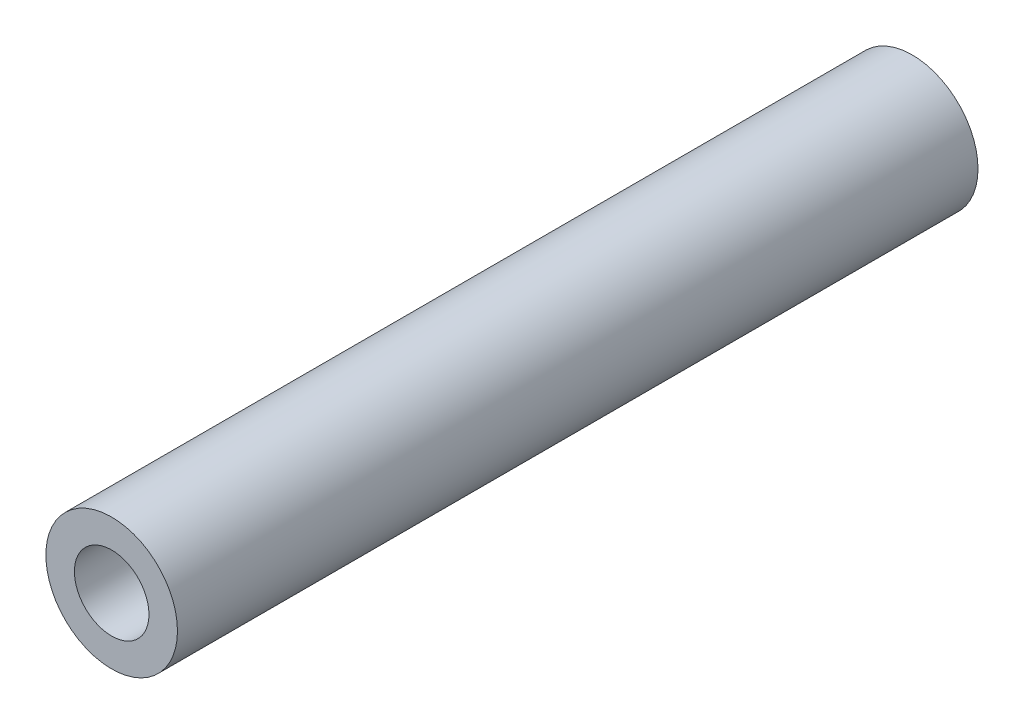
ISO-10303-21;
HEADER;
FILE_DESCRIPTION(('STEP AP214'),'2;1');
FILE_NAME('part.step','',(''),(''),'','','');
FILE_SCHEMA(('AUTOMOTIVE_DESIGN { 1 0 10303 214 1 1 1 1 }'));
ENDSEC;
DATA;
#1=APPLICATION_CONTEXT('core data for automotive mechanical design processes');
#2=APPLICATION_PROTOCOL_DEFINITION('international standard','automotive_design',2000,#1);
#3=PRODUCT_CONTEXT('',#1,'mechanical');
#4=PRODUCT('Part','Part','',(#3));
#5=PRODUCT_RELATED_PRODUCT_CATEGORY('part','',(#4));
#6=PRODUCT_DEFINITION_FORMATION('','',#4);
#7=PRODUCT_DEFINITION_CONTEXT('part definition',#1,'design');
#8=PRODUCT_DEFINITION('design','',#6,#7);
#9=PRODUCT_DEFINITION_SHAPE('','',#8);
#10=(LENGTH_UNIT() NAMED_UNIT(*) SI_UNIT(.MILLI.,.METRE.));
#11=(NAMED_UNIT(*) PLANE_ANGLE_UNIT() SI_UNIT($,.RADIAN.));
#12=(NAMED_UNIT(*) SI_UNIT($,.STERADIAN.) SOLID_ANGLE_UNIT());
#13=UNCERTAINTY_MEASURE_WITH_UNIT(LENGTH_MEASURE(1.E-05),#10,'distance_accuracy_value','');
#14=(GEOMETRIC_REPRESENTATION_CONTEXT(3) GLOBAL_UNCERTAINTY_ASSIGNED_CONTEXT((#13)) GLOBAL_UNIT_ASSIGNED_CONTEXT((#10,
#11,#12)) REPRESENTATION_CONTEXT('',''));
#15=CARTESIAN_POINT('',(0.,0.,0.));
#16=DIRECTION('',(0.,0.,1.));
#17=DIRECTION('',(1.,0.,0.));
#18=AXIS2_PLACEMENT_3D('',#15,#16,#17);
#19=CARTESIAN_POINT('',(0.,0.,36.5));
#20=DIRECTION('',(0.,0.,1.));
#21=DIRECTION('',(1.,0.,0.));
#22=AXIS2_PLACEMENT_3D('',#19,#20,#21);
#23=PLANE('',#22);
#24=CARTESIAN_POINT('',(0.,0.,36.5));
#25=DIRECTION('',(0.,0.,1.));
#26=DIRECTION('',(1.,0.,0.));
#27=AXIS2_PLACEMENT_3D('',#24,#25,#26);
#28=CIRCLE('',#27,3.);
#29=CARTESIAN_POINT('',(3.,0.,36.5));
#30=VERTEX_POINT('',#29);
#31=EDGE_CURVE('E10',#30,#30,#28,.T.);
#32=ORIENTED_EDGE('',*,*,#31,.T.);
#33=EDGE_LOOP('',(#32));
#34=FACE_BOUND('',#33,.T.);
#35=CARTESIAN_POINT('',(0.,0.,36.5));
#36=DIRECTION('',(0.,0.,1.));
#37=DIRECTION('',(1.,0.,0.));
#38=AXIS2_PLACEMENT_3D('',#35,#36,#37);
#39=CIRCLE('',#38,1.7);
#40=CARTESIAN_POINT('',(1.7,0.,36.5));
#41=VERTEX_POINT('',#40);
#42=EDGE_CURVE('E48',#41,#41,#39,.T.);
#43=ORIENTED_EDGE('',*,*,#42,.F.);
#44=EDGE_LOOP('',(#43));
#45=FACE_BOUND('',#44,.T.);
#46=ADVANCED_FACE('F40',(#34,#45),#23,.T.);
#47=CARTESIAN_POINT('',(0.,0.,0.));
#48=DIRECTION('',(0.,0.,1.));
#49=DIRECTION('',(1.,0.,0.));
#50=AXIS2_PLACEMENT_3D('',#47,#48,#49);
#51=PLANE('',#50);
#52=CARTESIAN_POINT('',(0.,0.,0.));
#53=DIRECTION('',(0.,0.,1.));
#54=DIRECTION('',(1.,0.,0.));
#55=AXIS2_PLACEMENT_3D('',#52,#53,#54);
#56=CIRCLE('',#55,3.);
#57=CARTESIAN_POINT('',(3.,0.,0.));
#58=VERTEX_POINT('',#57);
#59=EDGE_CURVE('E41',#58,#58,#56,.T.);
#60=ORIENTED_EDGE('',*,*,#59,.F.);
#61=EDGE_LOOP('',(#60));
#62=FACE_BOUND('',#61,.T.);
#63=CARTESIAN_POINT('',(0.,0.,0.));
#64=DIRECTION('',(0.,0.,1.));
#65=DIRECTION('',(1.,0.,0.));
#66=AXIS2_PLACEMENT_3D('',#63,#64,#65);
#67=CIRCLE('',#66,1.7);
#68=CARTESIAN_POINT('',(1.7,0.,0.));
#69=VERTEX_POINT('',#68);
#70=EDGE_CURVE('E49',#69,#69,#67,.T.);
#71=ORIENTED_EDGE('',*,*,#70,.T.);
#72=EDGE_LOOP('',(#71));
#73=FACE_BOUND('',#72,.T.);
#74=ADVANCED_FACE('F58',(#62,#73),#51,.F.);
#75=CARTESIAN_POINT('',(0.,0.,36.5));
#76=DIRECTION('',(0.,0.,-1.));
#77=DIRECTION('',(-1.,0.,0.));
#78=AXIS2_PLACEMENT_3D('',#75,#76,#77);
#79=CYLINDRICAL_SURFACE('',#78,3.);
#80=ORIENTED_EDGE('',*,*,#31,.F.);
#81=EDGE_LOOP('',(#80));
#82=FACE_BOUND('',#81,.T.);
#83=ORIENTED_EDGE('',*,*,#59,.T.);
#84=EDGE_LOOP('',(#83));
#85=FACE_BOUND('',#84,.T.);
#86=ADVANCED_FACE('F39',(#82,#85),#79,.T.);
#87=CARTESIAN_POINT('',(0.,0.,36.5));
#88=DIRECTION('',(0.,0.,-1.));
#89=DIRECTION('',(-1.,0.,0.));
#90=AXIS2_PLACEMENT_3D('',#87,#88,#89);
#91=CYLINDRICAL_SURFACE('',#90,1.7);
#92=ORIENTED_EDGE('',*,*,#42,.T.);
#93=EDGE_LOOP('',(#92));
#94=FACE_BOUND('',#93,.T.);
#95=ORIENTED_EDGE('',*,*,#70,.F.);
#96=EDGE_LOOP('',(#95));
#97=FACE_BOUND('',#96,.T.);
#98=ADVANCED_FACE('F57',(#94,#97),#91,.F.);
#99=CLOSED_SHELL('',(#46,#74,#86,#98));
#100=MANIFOLD_SOLID_BREP('B2',#99);
#101=ADVANCED_BREP_SHAPE_REPRESENTATION('',(#18,#100),#14);
#102=SHAPE_DEFINITION_REPRESENTATION(#9,#101);
ENDSEC;
END-ISO-10303-21;
